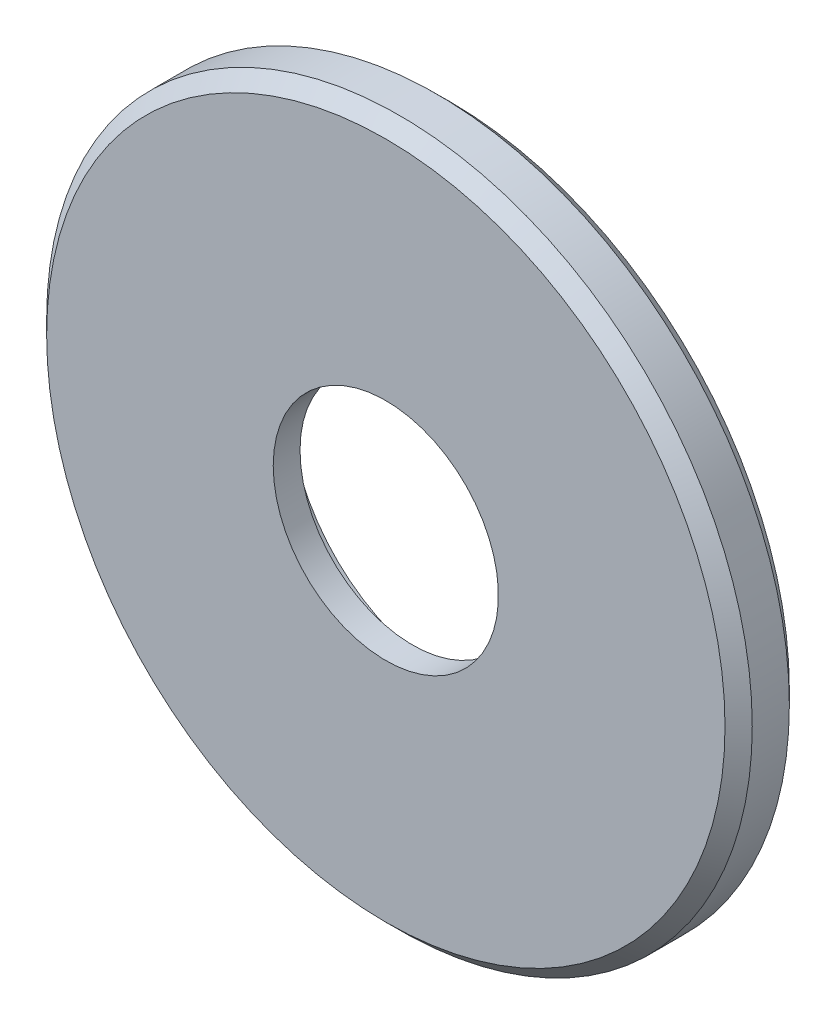
ISO-10303-21;
HEADER;
FILE_DESCRIPTION(('STEP AP214'),'2;1');
FILE_NAME('part.step','',(''),(''),'','','');
FILE_SCHEMA(('AUTOMOTIVE_DESIGN { 1 0 10303 214 1 1 1 1 }'));
ENDSEC;
DATA;
#1=APPLICATION_CONTEXT('core data for automotive mechanical design processes');
#2=APPLICATION_PROTOCOL_DEFINITION('international standard','automotive_design',2000,#1);
#3=PRODUCT_CONTEXT('',#1,'mechanical');
#4=PRODUCT('Part','Part','',(#3));
#5=PRODUCT_RELATED_PRODUCT_CATEGORY('part','',(#4));
#6=PRODUCT_DEFINITION_FORMATION('','',#4);
#7=PRODUCT_DEFINITION_CONTEXT('part definition',#1,'design');
#8=PRODUCT_DEFINITION('design','',#6,#7);
#9=PRODUCT_DEFINITION_SHAPE('','',#8);
#10=(LENGTH_UNIT() NAMED_UNIT(*) SI_UNIT(.MILLI.,.METRE.));
#11=(NAMED_UNIT(*) PLANE_ANGLE_UNIT() SI_UNIT($,.RADIAN.));
#12=(NAMED_UNIT(*) SI_UNIT($,.STERADIAN.) SOLID_ANGLE_UNIT());
#13=UNCERTAINTY_MEASURE_WITH_UNIT(LENGTH_MEASURE(1.E-05),#10,'distance_accuracy_value','');
#14=(GEOMETRIC_REPRESENTATION_CONTEXT(3) GLOBAL_UNCERTAINTY_ASSIGNED_CONTEXT((#13)) GLOBAL_UNIT_ASSIGNED_CONTEXT((#10,
#11,#12)) REPRESENTATION_CONTEXT('',''));
#15=CARTESIAN_POINT('',(0.,0.,0.));
#16=DIRECTION('',(0.,0.,1.));
#17=DIRECTION('',(1.,0.,0.));
#18=AXIS2_PLACEMENT_3D('',#15,#16,#17);
#19=CARTESIAN_POINT('',(0.,0.,12.));
#20=DIRECTION('',(0.,0.,-1.));
#21=DIRECTION('',(-1.,0.,0.));
#22=AXIS2_PLACEMENT_3D('',#19,#20,#21);
#23=CYLINDRICAL_SURFACE('',#22,21.);
#24=CARTESIAN_POINT('',(0.,0.,12.));
#25=DIRECTION('',(0.,0.,-1.));
#26=DIRECTION('',(-1.,0.,0.));
#27=AXIS2_PLACEMENT_3D('',#24,#25,#26);
#28=CIRCLE('',#27,21.);
#29=CARTESIAN_POINT('',(-21.,0.,12.));
#30=VERTEX_POINT('',#29);
#31=EDGE_CURVE('E91',#30,#30,#28,.T.);
#32=ORIENTED_EDGE('',*,*,#31,.F.);
#33=EDGE_LOOP('',(#32));
#34=FACE_BOUND('',#33,.T.);
#35=CARTESIAN_POINT('',(0.,0.,7.));
#36=DIRECTION('',(0.,0.,-1.));
#37=DIRECTION('',(-1.,0.,0.));
#38=AXIS2_PLACEMENT_3D('',#35,#36,#37);
#39=CIRCLE('',#38,21.);
#40=CARTESIAN_POINT('',(-21.,0.,7.));
#41=VERTEX_POINT('',#40);
#42=EDGE_CURVE('E45',#41,#41,#39,.F.);
#43=ORIENTED_EDGE('',*,*,#42,.F.);
#44=EDGE_LOOP('',(#43));
#45=FACE_BOUND('',#44,.T.);
#46=ADVANCED_FACE('F40',(#34,#45),#23,.F.);
#47=CARTESIAN_POINT('',(0.,0.,12.));
#48=DIRECTION('',(0.,0.,-1.));
#49=DIRECTION('',(-1.,0.,0.));
#50=AXIS2_PLACEMENT_3D('',#47,#48,#49);
#51=CYLINDRICAL_SURFACE('',#50,65.794178673);
#52=CARTESIAN_POINT('',(0.,0.,2.54));
#53=DIRECTION('',(0.,0.,1.));
#54=DIRECTION('',(1.,0.,0.));
#55=AXIS2_PLACEMENT_3D('',#52,#53,#54);
#56=CIRCLE('',#55,65.794178673);
#57=CARTESIAN_POINT('',(65.794178673,0.,2.54));
#58=VERTEX_POINT('',#57);
#59=EDGE_CURVE('E53',#58,#58,#56,.T.);
#60=ORIENTED_EDGE('',*,*,#59,.T.);
#61=EDGE_LOOP('',(#60));
#62=FACE_BOUND('',#61,.T.);
#63=CARTESIAN_POINT('',(0.,0.,9.46));
#64=DIRECTION('',(0.,0.,1.));
#65=DIRECTION('',(1.,0.,0.));
#66=AXIS2_PLACEMENT_3D('',#63,#64,#65);
#67=CIRCLE('',#66,65.794178673);
#68=CARTESIAN_POINT('',(65.794178673,0.,9.46));
#69=VERTEX_POINT('',#68);
#70=EDGE_CURVE('E58',#69,#69,#67,.F.);
#71=ORIENTED_EDGE('',*,*,#70,.T.);
#72=EDGE_LOOP('',(#71));
#73=FACE_BOUND('',#72,.T.);
#74=ADVANCED_FACE('F113',(#62,#73),#51,.T.);
#75=CARTESIAN_POINT('',(0.,0.,12.));
#76=DIRECTION('',(0.,0.,1.));
#77=DIRECTION('',(1.,0.,0.));
#78=AXIS2_PLACEMENT_3D('',#75,#76,#77);
#79=PLANE('',#78);
#80=ORIENTED_EDGE('',*,*,#31,.T.);
#81=EDGE_LOOP('',(#80));
#82=FACE_BOUND('',#81,.T.);
#83=CARTESIAN_POINT('',(0.,0.,12.));
#84=DIRECTION('',(0.,0.,1.));
#85=DIRECTION('',(1.,0.,0.));
#86=AXIS2_PLACEMENT_3D('',#83,#84,#85);
#87=CIRCLE('',#86,63.254178673);
#88=CARTESIAN_POINT('',(63.254178673,0.,12.));
#89=VERTEX_POINT('',#88);
#90=EDGE_CURVE('E12',#89,#89,#87,.T.);
#91=ORIENTED_EDGE('',*,*,#90,.T.);
#92=EDGE_LOOP('',(#91));
#93=FACE_BOUND('',#92,.T.);
#94=ADVANCED_FACE('F119',(#82,#93),#79,.T.);
#95=CARTESIAN_POINT('',(0.,0.,0.));
#96=DIRECTION('',(0.,0.,1.));
#97=DIRECTION('',(1.,0.,0.));
#98=AXIS2_PLACEMENT_3D('',#95,#96,#97);
#99=PLANE('',#98);
#100=CARTESIAN_POINT('',(0.,0.,0.));
#101=DIRECTION('',(0.,0.,-1.));
#102=DIRECTION('',(-1.,0.,0.));
#103=AXIS2_PLACEMENT_3D('',#100,#101,#102);
#104=CIRCLE('',#103,30.);
#105=CARTESIAN_POINT('',(-30.,0.,0.));
#106=VERTEX_POINT('',#105);
#107=EDGE_CURVE('E100',#106,#106,#104,.T.);
#108=ORIENTED_EDGE('',*,*,#107,.F.);
#109=EDGE_LOOP('',(#108));
#110=FACE_BOUND('',#109,.T.);
#111=CARTESIAN_POINT('',(-0.551144241845172,48.3555721209258,0.));
#112=DIRECTION('',(0.,0.,-1.));
#113=DIRECTION('',(-1.,0.,0.));
#114=AXIS2_PLACEMENT_3D('',#111,#112,#113);
#115=CIRCLE('',#114,10.5);
#116=CARTESIAN_POINT('',(-11.0511442418452,48.3555721209258,0.));
#117=VERTEX_POINT('',#116);
#118=EDGE_CURVE('E87',#117,#117,#115,.T.);
#119=ORIENTED_EDGE('',*,*,#118,.F.);
#120=EDGE_LOOP('',(#119));
#121=FACE_BOUND('',#120,.T.);
#122=CARTESIAN_POINT('',(41.6015817503291,24.6550909750491,0.));
#123=DIRECTION('',(0.,0.,-1.));
#124=DIRECTION('',(-1.,0.,0.));
#125=AXIS2_PLACEMENT_3D('',#122,#123,#124);
#126=CIRCLE('',#125,10.5);
#127=CARTESIAN_POINT('',(31.1015817503291,24.6550909750491,0.));
#128=VERTEX_POINT('',#127);
#129=EDGE_CURVE('E66',#128,#128,#126,.T.);
#130=ORIENTED_EDGE('',*,*,#129,.F.);
#131=EDGE_LOOP('',(#130));
#132=FACE_BOUND('',#131,.T.);
#133=CARTESIAN_POINT('',(42.1527259921729,-23.7004811458767,0.));
#134=DIRECTION('',(0.,0.,-1.));
#135=DIRECTION('',(-1.,0.,0.));
#136=AXIS2_PLACEMENT_3D('',#133,#134,#135);
#137=CIRCLE('',#136,10.5);
#138=CARTESIAN_POINT('',(31.6527259921729,-23.7004811458767,0.));
#139=VERTEX_POINT('',#138);
#140=EDGE_CURVE('E65',#139,#139,#137,.T.);
#141=ORIENTED_EDGE('',*,*,#140,.F.);
#142=EDGE_LOOP('',(#141));
#143=FACE_BOUND('',#142,.T.);
#144=CARTESIAN_POINT('',(0.551144241842443,-48.3555721209259,0.));
#145=DIRECTION('',(0.,0.,-1.));
#146=DIRECTION('',(-1.,0.,0.));
#147=AXIS2_PLACEMENT_3D('',#144,#145,#146);
#148=CIRCLE('',#147,10.5);
#149=CARTESIAN_POINT('',(-9.94885575815756,-48.3555721209259,0.));
#150=VERTEX_POINT('',#149);
#151=EDGE_CURVE('E72',#150,#150,#148,.T.);
#152=ORIENTED_EDGE('',*,*,#151,.F.);
#153=EDGE_LOOP('',(#152));
#154=FACE_BOUND('',#153,.T.);
#155=CARTESIAN_POINT('',(-41.6015817503318,-24.6550909750492,0.));
#156=DIRECTION('',(0.,0.,-1.));
#157=DIRECTION('',(-1.,0.,0.));
#158=AXIS2_PLACEMENT_3D('',#155,#156,#157);
#159=CIRCLE('',#158,10.5);
#160=CARTESIAN_POINT('',(-52.1015817503318,-24.6550909750492,0.));
#161=VERTEX_POINT('',#160);
#162=EDGE_CURVE('E78',#161,#161,#159,.T.);
#163=ORIENTED_EDGE('',*,*,#162,.F.);
#164=EDGE_LOOP('',(#163));
#165=FACE_BOUND('',#164,.T.);
#166=CARTESIAN_POINT('',(-42.1527259921756,23.7004811458767,0.));
#167=DIRECTION('',(0.,0.,-1.));
#168=DIRECTION('',(-1.,0.,0.));
#169=AXIS2_PLACEMENT_3D('',#166,#167,#168);
#170=CIRCLE('',#169,10.5);
#171=CARTESIAN_POINT('',(-52.6527259921756,23.7004811458767,0.));
#172=VERTEX_POINT('',#171);
#173=EDGE_CURVE('E84',#172,#172,#170,.T.);
#174=ORIENTED_EDGE('',*,*,#173,.F.);
#175=EDGE_LOOP('',(#174));
#176=FACE_BOUND('',#175,.T.);
#177=CARTESIAN_POINT('',(0.,0.,0.));
#178=DIRECTION('',(0.,0.,1.));
#179=DIRECTION('',(1.,0.,0.));
#180=AXIS2_PLACEMENT_3D('',#177,#178,#179);
#181=CIRCLE('',#180,63.254178673);
#182=CARTESIAN_POINT('',(63.254178673,0.,0.));
#183=VERTEX_POINT('',#182);
#184=EDGE_CURVE('E49',#183,#183,#181,.F.);
#185=ORIENTED_EDGE('',*,*,#184,.T.);
#186=EDGE_LOOP('',(#185));
#187=FACE_BOUND('',#186,.T.);
#188=ADVANCED_FACE('F177',(#110,#121,#132,#143,#154,#165,#176,#187),#99,.F.);
#189=CARTESIAN_POINT('',(0.,0.,2.54));
#190=DIRECTION('',(0.,0.,1.));
#191=DIRECTION('',(1.,0.,0.));
#192=AXIS2_PLACEMENT_3D('',#189,#190,#191);
#193=CONICAL_SURFACE('',#192,65.794178673,0.785398163397448);
#194=ORIENTED_EDGE('',*,*,#184,.F.);
#195=EDGE_LOOP('',(#194));
#196=FACE_BOUND('',#195,.T.);
#197=ORIENTED_EDGE('',*,*,#59,.F.);
#198=EDGE_LOOP('',(#197));
#199=FACE_BOUND('',#198,.T.);
#200=ADVANCED_FACE('F180',(#196,#199),#193,.T.);
#201=CARTESIAN_POINT('',(0.,0.,12.));
#202=DIRECTION('',(0.,0.,-1.));
#203=DIRECTION('',(-1.,0.,0.));
#204=AXIS2_PLACEMENT_3D('',#201,#202,#203);
#205=CONICAL_SURFACE('',#204,63.254178673,0.785398163397448);
#206=ORIENTED_EDGE('',*,*,#70,.F.);
#207=EDGE_LOOP('',(#206));
#208=FACE_BOUND('',#207,.T.);
#209=ORIENTED_EDGE('',*,*,#90,.F.);
#210=EDGE_LOOP('',(#209));
#211=FACE_BOUND('',#210,.T.);
#212=ADVANCED_FACE('F43',(#208,#211),#205,.T.);
#213=CARTESIAN_POINT('',(-42.1527259921756,23.7004811458767,5.));
#214=DIRECTION('',(0.,0.,-1.));
#215=DIRECTION('',(-1.,0.,0.));
#216=AXIS2_PLACEMENT_3D('',#213,#214,#215);
#217=CYLINDRICAL_SURFACE('',#216,10.5);
#218=CARTESIAN_POINT('',(-42.1527259921756,23.7004811458767,5.));
#219=DIRECTION('',(0.,0.,-1.));
#220=DIRECTION('',(-1.,0.,0.));
#221=AXIS2_PLACEMENT_3D('',#218,#219,#220);
#222=CIRCLE('',#221,10.5);
#223=CARTESIAN_POINT('',(-52.6527259921756,23.7004811458767,5.));
#224=VERTEX_POINT('',#223);
#225=EDGE_CURVE('E81',#224,#224,#222,.T.);
#226=ORIENTED_EDGE('',*,*,#225,.F.);
#227=EDGE_LOOP('',(#226));
#228=FACE_BOUND('',#227,.T.);
#229=ORIENTED_EDGE('',*,*,#173,.T.);
#230=EDGE_LOOP('',(#229));
#231=FACE_BOUND('',#230,.T.);
#232=ADVANCED_FACE('F144',(#228,#231),#217,.F.);
#233=CARTESIAN_POINT('',(-42.1527259921756,23.7004811458767,5.));
#234=DIRECTION('',(0.,0.,-1.));
#235=DIRECTION('',(-1.,0.,0.));
#236=AXIS2_PLACEMENT_3D('',#233,#234,#235);
#237=PLANE('',#236);
#238=ORIENTED_EDGE('',*,*,#225,.T.);
#239=EDGE_LOOP('',(#238));
#240=FACE_BOUND('',#239,.T.);
#241=ADVANCED_FACE('F147',(#240),#237,.T.);
#242=CARTESIAN_POINT('',(-41.6015817503318,-24.6550909750492,5.));
#243=DIRECTION('',(0.,0.,-1.));
#244=DIRECTION('',(-1.,0.,0.));
#245=AXIS2_PLACEMENT_3D('',#242,#243,#244);
#246=CYLINDRICAL_SURFACE('',#245,10.5);
#247=CARTESIAN_POINT('',(-41.6015817503318,-24.6550909750492,5.));
#248=DIRECTION('',(0.,0.,-1.));
#249=DIRECTION('',(-1.,0.,0.));
#250=AXIS2_PLACEMENT_3D('',#247,#248,#249);
#251=CIRCLE('',#250,10.5);
#252=CARTESIAN_POINT('',(-52.1015817503318,-24.6550909750492,5.));
#253=VERTEX_POINT('',#252);
#254=EDGE_CURVE('E75',#253,#253,#251,.T.);
#255=ORIENTED_EDGE('',*,*,#254,.F.);
#256=EDGE_LOOP('',(#255));
#257=FACE_BOUND('',#256,.T.);
#258=ORIENTED_EDGE('',*,*,#162,.T.);
#259=EDGE_LOOP('',(#258));
#260=FACE_BOUND('',#259,.T.);
#261=ADVANCED_FACE('F151',(#257,#260),#246,.F.);
#262=CARTESIAN_POINT('',(-41.6015817503318,-24.6550909750492,5.));
#263=DIRECTION('',(0.,0.,-1.));
#264=DIRECTION('',(-1.,0.,0.));
#265=AXIS2_PLACEMENT_3D('',#262,#263,#264);
#266=PLANE('',#265);
#267=ORIENTED_EDGE('',*,*,#254,.T.);
#268=EDGE_LOOP('',(#267));
#269=FACE_BOUND('',#268,.T.);
#270=ADVANCED_FACE('F155',(#269),#266,.T.);
#271=CARTESIAN_POINT('',(0.551144241842443,-48.3555721209259,5.));
#272=DIRECTION('',(0.,0.,-1.));
#273=DIRECTION('',(-1.,0.,0.));
#274=AXIS2_PLACEMENT_3D('',#271,#272,#273);
#275=CYLINDRICAL_SURFACE('',#274,10.5);
#276=CARTESIAN_POINT('',(0.551144241842443,-48.3555721209259,5.));
#277=DIRECTION('',(0.,0.,-1.));
#278=DIRECTION('',(-1.,0.,0.));
#279=AXIS2_PLACEMENT_3D('',#276,#277,#278);
#280=CIRCLE('',#279,10.5);
#281=CARTESIAN_POINT('',(-9.94885575815756,-48.3555721209259,5.));
#282=VERTEX_POINT('',#281);
#283=EDGE_CURVE('E69',#282,#282,#280,.T.);
#284=ORIENTED_EDGE('',*,*,#283,.F.);
#285=EDGE_LOOP('',(#284));
#286=FACE_BOUND('',#285,.T.);
#287=ORIENTED_EDGE('',*,*,#151,.T.);
#288=EDGE_LOOP('',(#287));
#289=FACE_BOUND('',#288,.T.);
#290=ADVANCED_FACE('F159',(#286,#289),#275,.F.);
#291=CARTESIAN_POINT('',(0.551144241842443,-48.3555721209259,5.));
#292=DIRECTION('',(0.,0.,-1.));
#293=DIRECTION('',(-1.,0.,0.));
#294=AXIS2_PLACEMENT_3D('',#291,#292,#293);
#295=PLANE('',#294);
#296=ORIENTED_EDGE('',*,*,#283,.T.);
#297=EDGE_LOOP('',(#296));
#298=FACE_BOUND('',#297,.T.);
#299=ADVANCED_FACE('F163',(#298),#295,.T.);
#300=CARTESIAN_POINT('',(42.1527259921729,-23.7004811458767,5.));
#301=DIRECTION('',(0.,0.,-1.));
#302=DIRECTION('',(-1.,0.,0.));
#303=AXIS2_PLACEMENT_3D('',#300,#301,#302);
#304=CYLINDRICAL_SURFACE('',#303,10.5);
#305=CARTESIAN_POINT('',(42.1527259921729,-23.7004811458767,5.));
#306=DIRECTION('',(0.,0.,-1.));
#307=DIRECTION('',(-1.,0.,0.));
#308=AXIS2_PLACEMENT_3D('',#305,#306,#307);
#309=CIRCLE('',#308,10.5);
#310=CARTESIAN_POINT('',(31.6527259921729,-23.7004811458767,5.));
#311=VERTEX_POINT('',#310);
#312=EDGE_CURVE('E62',#311,#311,#309,.T.);
#313=ORIENTED_EDGE('',*,*,#312,.F.);
#314=EDGE_LOOP('',(#313));
#315=FACE_BOUND('',#314,.T.);
#316=ORIENTED_EDGE('',*,*,#140,.T.);
#317=EDGE_LOOP('',(#316));
#318=FACE_BOUND('',#317,.T.);
#319=ADVANCED_FACE('F167',(#315,#318),#304,.F.);
#320=CARTESIAN_POINT('',(42.1527259921729,-23.7004811458767,5.));
#321=DIRECTION('',(0.,0.,-1.));
#322=DIRECTION('',(-1.,0.,0.));
#323=AXIS2_PLACEMENT_3D('',#320,#321,#322);
#324=PLANE('',#323);
#325=ORIENTED_EDGE('',*,*,#312,.T.);
#326=EDGE_LOOP('',(#325));
#327=FACE_BOUND('',#326,.T.);
#328=ADVANCED_FACE('F139',(#327),#324,.T.);
#329=CARTESIAN_POINT('',(41.6015817503291,24.6550909750491,5.));
#330=DIRECTION('',(0.,0.,-1.));
#331=DIRECTION('',(-1.,0.,0.));
#332=AXIS2_PLACEMENT_3D('',#329,#330,#331);
#333=CYLINDRICAL_SURFACE('',#332,10.5);
#334=CARTESIAN_POINT('',(41.6015817503291,24.6550909750491,5.));
#335=DIRECTION('',(0.,0.,-1.));
#336=DIRECTION('',(-1.,0.,0.));
#337=AXIS2_PLACEMENT_3D('',#334,#335,#336);
#338=CIRCLE('',#337,10.5);
#339=CARTESIAN_POINT('',(31.1015817503291,24.6550909750491,5.));
#340=VERTEX_POINT('',#339);
#341=EDGE_CURVE('E88',#340,#340,#338,.T.);
#342=ORIENTED_EDGE('',*,*,#341,.F.);
#343=EDGE_LOOP('',(#342));
#344=FACE_BOUND('',#343,.T.);
#345=ORIENTED_EDGE('',*,*,#129,.T.);
#346=EDGE_LOOP('',(#345));
#347=FACE_BOUND('',#346,.T.);
#348=ADVANCED_FACE('F136',(#344,#347),#333,.F.);
#349=CARTESIAN_POINT('',(41.6015817503291,24.6550909750491,5.));
#350=DIRECTION('',(0.,0.,-1.));
#351=DIRECTION('',(-1.,0.,0.));
#352=AXIS2_PLACEMENT_3D('',#349,#350,#351);
#353=PLANE('',#352);
#354=ORIENTED_EDGE('',*,*,#341,.T.);
#355=EDGE_LOOP('',(#354));
#356=FACE_BOUND('',#355,.T.);
#357=ADVANCED_FACE('F134',(#356),#353,.T.);
#358=CARTESIAN_POINT('',(-0.551144241845172,48.3555721209258,5.));
#359=DIRECTION('',(0.,0.,-1.));
#360=DIRECTION('',(-1.,0.,0.));
#361=AXIS2_PLACEMENT_3D('',#358,#359,#360);
#362=CYLINDRICAL_SURFACE('',#361,10.5);
#363=CARTESIAN_POINT('',(-0.551144241845172,48.3555721209258,5.));
#364=DIRECTION('',(0.,0.,-1.));
#365=DIRECTION('',(-1.,0.,0.));
#366=AXIS2_PLACEMENT_3D('',#363,#364,#365);
#367=CIRCLE('',#366,10.5);
#368=CARTESIAN_POINT('',(-11.0511442418452,48.3555721209258,5.));
#369=VERTEX_POINT('',#368);
#370=EDGE_CURVE('E61',#369,#369,#367,.T.);
#371=ORIENTED_EDGE('',*,*,#370,.F.);
#372=EDGE_LOOP('',(#371));
#373=FACE_BOUND('',#372,.T.);
#374=ORIENTED_EDGE('',*,*,#118,.T.);
#375=EDGE_LOOP('',(#374));
#376=FACE_BOUND('',#375,.T.);
#377=ADVANCED_FACE('F130',(#373,#376),#362,.F.);
#378=CARTESIAN_POINT('',(-0.551144241845172,48.3555721209258,5.));
#379=DIRECTION('',(0.,0.,-1.));
#380=DIRECTION('',(-1.,0.,0.));
#381=AXIS2_PLACEMENT_3D('',#378,#379,#380);
#382=PLANE('',#381);
#383=ORIENTED_EDGE('',*,*,#370,.T.);
#384=EDGE_LOOP('',(#383));
#385=FACE_BOUND('',#384,.T.);
#386=ADVANCED_FACE('F127',(#385),#382,.T.);
#387=CARTESIAN_POINT('',(0.,0.,7.));
#388=DIRECTION('',(0.,0.,-1.));
#389=DIRECTION('',(-1.,0.,0.));
#390=AXIS2_PLACEMENT_3D('',#387,#388,#389);
#391=PLANE('',#390);
#392=CARTESIAN_POINT('',(0.,0.,7.));
#393=DIRECTION('',(0.,0.,-1.));
#394=DIRECTION('',(-1.,0.,0.));
#395=AXIS2_PLACEMENT_3D('',#392,#393,#394);
#396=CIRCLE('',#395,30.);
#397=CARTESIAN_POINT('',(-30.,0.,7.));
#398=VERTEX_POINT('',#397);
#399=EDGE_CURVE('E103',#398,#398,#396,.T.);
#400=ORIENTED_EDGE('',*,*,#399,.T.);
#401=EDGE_LOOP('',(#400));
#402=FACE_BOUND('',#401,.T.);
#403=ORIENTED_EDGE('',*,*,#42,.T.);
#404=EDGE_LOOP('',(#403));
#405=FACE_BOUND('',#404,.T.);
#406=ADVANCED_FACE('F110',(#402,#405),#391,.T.);
#407=CARTESIAN_POINT('',(0.,0.,7.));
#408=DIRECTION('',(0.,0.,-1.));
#409=DIRECTION('',(-1.,0.,0.));
#410=AXIS2_PLACEMENT_3D('',#407,#408,#409);
#411=CYLINDRICAL_SURFACE('',#410,30.);
#412=ORIENTED_EDGE('',*,*,#399,.F.);
#413=EDGE_LOOP('',(#412));
#414=FACE_BOUND('',#413,.T.);
#415=ORIENTED_EDGE('',*,*,#107,.T.);
#416=EDGE_LOOP('',(#415));
#417=FACE_BOUND('',#416,.T.);
#418=ADVANCED_FACE('F125',(#414,#417),#411,.F.);
#419=CLOSED_SHELL('',(#46,#74,#94,#188,#200,#212,#232,#241,#261,#270,#290,#299,#319,#328,#348,
#357,#377,#386,#406,#418));
#420=MANIFOLD_SOLID_BREP('B2',#419);
#421=ADVANCED_BREP_SHAPE_REPRESENTATION('',(#18,#420),#14);
#422=SHAPE_DEFINITION_REPRESENTATION(#9,#421);
ENDSEC;
END-ISO-10303-21;
